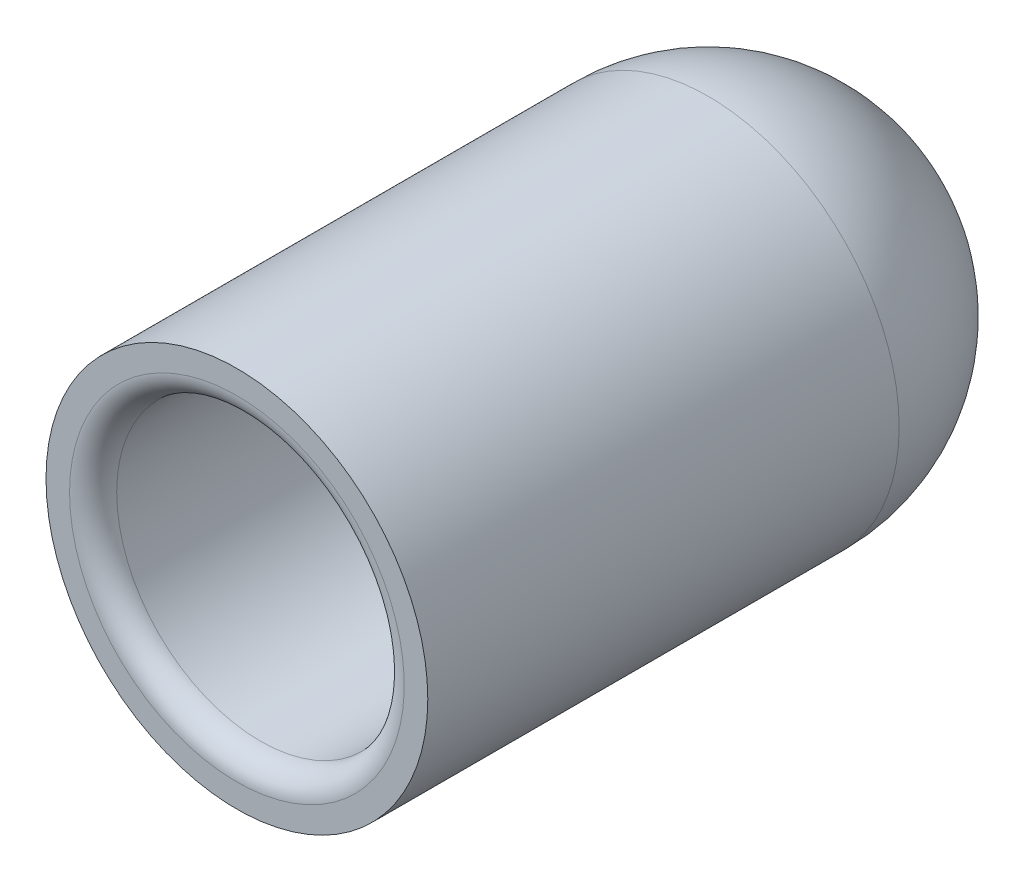
ISO-10303-21;
HEADER;
FILE_DESCRIPTION(('STEP AP214'),'2;1');
FILE_NAME('part.step','',(''),(''),'','','');
FILE_SCHEMA(('AUTOMOTIVE_DESIGN { 1 0 10303 214 1 1 1 1 }'));
ENDSEC;
DATA;
#1=APPLICATION_CONTEXT('core data for automotive mechanical design processes');
#2=APPLICATION_PROTOCOL_DEFINITION('international standard','automotive_design',2000,#1);
#3=PRODUCT_CONTEXT('',#1,'mechanical');
#4=PRODUCT('Part','Part','',(#3));
#5=PRODUCT_RELATED_PRODUCT_CATEGORY('part','',(#4));
#6=PRODUCT_DEFINITION_FORMATION('','',#4);
#7=PRODUCT_DEFINITION_CONTEXT('part definition',#1,'design');
#8=PRODUCT_DEFINITION('design','',#6,#7);
#9=PRODUCT_DEFINITION_SHAPE('','',#8);
#10=(LENGTH_UNIT() NAMED_UNIT(*) SI_UNIT(.MILLI.,.METRE.));
#11=(NAMED_UNIT(*) PLANE_ANGLE_UNIT() SI_UNIT($,.RADIAN.));
#12=(NAMED_UNIT(*) SI_UNIT($,.STERADIAN.) SOLID_ANGLE_UNIT());
#13=UNCERTAINTY_MEASURE_WITH_UNIT(LENGTH_MEASURE(1.E-05),#10,'distance_accuracy_value','');
#14=(GEOMETRIC_REPRESENTATION_CONTEXT(3) GLOBAL_UNCERTAINTY_ASSIGNED_CONTEXT((#13)) GLOBAL_UNIT_ASSIGNED_CONTEXT((#10,
#11,#12)) REPRESENTATION_CONTEXT('',''));
#15=CARTESIAN_POINT('',(0.,0.,0.));
#16=DIRECTION('',(0.,0.,1.));
#17=DIRECTION('',(1.,0.,0.));
#18=AXIS2_PLACEMENT_3D('',#15,#16,#17);
#19=CARTESIAN_POINT('',(0.,0.,-20.));
#20=DIRECTION('',(0.,0.,1.));
#21=DIRECTION('',(-1.,0.,0.));
#22=AXIS2_PLACEMENT_3D('',#19,#20,#21);
#23=SPHERICAL_SURFACE('',#22,8.1);
#24=CARTESIAN_POINT('',(0.,0.,-20.));
#25=DIRECTION('',(0.,0.,1.));
#26=DIRECTION('',(1.,0.,0.));
#27=AXIS2_PLACEMENT_3D('',#24,#25,#26);
#28=CIRCLE('',#27,8.1);
#29=CARTESIAN_POINT('',(8.1,0.,-20.));
#30=VERTEX_POINT('',#29);
#31=EDGE_CURVE('E57',#30,#30,#28,.T.);
#32=ORIENTED_EDGE('',*,*,#31,.F.);
#33=EDGE_LOOP('',(#32));
#34=FACE_BOUND('',#33,.T.);
#35=ADVANCED_FACE('F44',(#34),#23,.T.);
#36=CARTESIAN_POINT('',(0.,0.,0.));
#37=DIRECTION('',(0.,0.,1.));
#38=DIRECTION('',(1.,0.,0.));
#39=AXIS2_PLACEMENT_3D('',#36,#37,#38);
#40=CYLINDRICAL_SURFACE('',#39,8.1);
#41=CARTESIAN_POINT('',(0.,0.,0.));
#42=DIRECTION('',(0.,0.,1.));
#43=DIRECTION('',(1.,0.,0.));
#44=AXIS2_PLACEMENT_3D('',#41,#42,#43);
#45=CIRCLE('',#44,8.1);
#46=CARTESIAN_POINT('',(8.1,0.,0.));
#47=VERTEX_POINT('',#46);
#48=EDGE_CURVE('E62',#47,#47,#45,.T.);
#49=ORIENTED_EDGE('',*,*,#48,.F.);
#50=EDGE_LOOP('',(#49));
#51=FACE_BOUND('',#50,.T.);
#52=ORIENTED_EDGE('',*,*,#31,.T.);
#53=EDGE_LOOP('',(#52));
#54=FACE_BOUND('',#53,.T.);
#55=ADVANCED_FACE('F85',(#51,#54),#40,.T.);
#56=CARTESIAN_POINT('',(0.,0.,0.));
#57=DIRECTION('',(0.,0.,-1.));
#58=DIRECTION('',(-1.,0.,0.));
#59=AXIS2_PLACEMENT_3D('',#56,#57,#58);
#60=PLANE('',#59);
#61=CARTESIAN_POINT('',(0.,0.,0.));
#62=DIRECTION('',(0.,0.,-1.));
#63=DIRECTION('',(-1.,0.,0.));
#64=AXIS2_PLACEMENT_3D('',#61,#62,#63);
#65=CIRCLE('',#64,7.1);
#66=CARTESIAN_POINT('',(-7.1,0.,0.));
#67=VERTEX_POINT('',#66);
#68=EDGE_CURVE('E10',#67,#67,#65,.T.);
#69=ORIENTED_EDGE('',*,*,#68,.T.);
#70=EDGE_LOOP('',(#69));
#71=FACE_BOUND('',#70,.T.);
#72=ORIENTED_EDGE('',*,*,#48,.T.);
#73=EDGE_LOOP('',(#72));
#74=FACE_BOUND('',#73,.T.);
#75=ADVANCED_FACE('F77',(#71,#74),#60,.F.);
#76=CARTESIAN_POINT('',(0.,0.,0.));
#77=DIRECTION('',(0.,0.,1.));
#78=DIRECTION('',(1.,0.,0.));
#79=AXIS2_PLACEMENT_3D('',#76,#77,#78);
#80=CYLINDRICAL_SURFACE('',#79,6.1);
#81=CARTESIAN_POINT('',(0.,0.,-0.999999999999999));
#82=DIRECTION('',(0.,0.,-1.));
#83=DIRECTION('',(-1.,0.,0.));
#84=AXIS2_PLACEMENT_3D('',#81,#82,#83);
#85=CIRCLE('',#84,6.1);
#86=CARTESIAN_POINT('',(-6.1,0.,-0.999999999999999));
#87=VERTEX_POINT('',#86);
#88=EDGE_CURVE('E52',#87,#87,#85,.F.);
#89=ORIENTED_EDGE('',*,*,#88,.T.);
#90=EDGE_LOOP('',(#89));
#91=FACE_BOUND('',#90,.T.);
#92=CARTESIAN_POINT('',(0.,0.,-20.));
#93=DIRECTION('',(0.,0.,1.));
#94=DIRECTION('',(1.,0.,0.));
#95=AXIS2_PLACEMENT_3D('',#92,#93,#94);
#96=CIRCLE('',#95,6.1);
#97=CARTESIAN_POINT('',(6.1,0.,-20.));
#98=VERTEX_POINT('',#97);
#99=EDGE_CURVE('E68',#98,#98,#96,.T.);
#100=ORIENTED_EDGE('',*,*,#99,.F.);
#101=EDGE_LOOP('',(#100));
#102=FACE_BOUND('',#101,.T.);
#103=ADVANCED_FACE('F75',(#91,#102),#80,.F.);
#104=CARTESIAN_POINT('',(0.,0.,-20.));
#105=DIRECTION('',(0.,0.,1.));
#106=DIRECTION('',(-1.,0.,0.));
#107=AXIS2_PLACEMENT_3D('',#104,#105,#106);
#108=SPHERICAL_SURFACE('',#107,6.1);
#109=ORIENTED_EDGE('',*,*,#99,.T.);
#110=EDGE_LOOP('',(#109));
#111=FACE_BOUND('',#110,.T.);
#112=ADVANCED_FACE('F73',(#111),#108,.F.);
#113=CARTESIAN_POINT('',(0.,0.,-0.999999999999999));
#114=DIRECTION('',(0.,0.,-1.));
#115=DIRECTION('',(-1.,0.,0.));
#116=AXIS2_PLACEMENT_3D('',#113,#114,#115);
#117=TOROIDAL_SURFACE('',#116,7.1,1.);
#118=ORIENTED_EDGE('',*,*,#68,.F.);
#119=EDGE_LOOP('',(#118));
#120=FACE_BOUND('',#119,.T.);
#121=ORIENTED_EDGE('',*,*,#88,.F.);
#122=EDGE_LOOP('',(#121));
#123=FACE_BOUND('',#122,.T.);
#124=ADVANCED_FACE('F46',(#120,#123),#117,.T.);
#125=CLOSED_SHELL('',(#35,#55,#75,#103,#112,#124));
#126=MANIFOLD_SOLID_BREP('B2',#125);
#127=ADVANCED_BREP_SHAPE_REPRESENTATION('',(#18,#126),#14);
#128=SHAPE_DEFINITION_REPRESENTATION(#9,#127);
ENDSEC;
END-ISO-10303-21;
